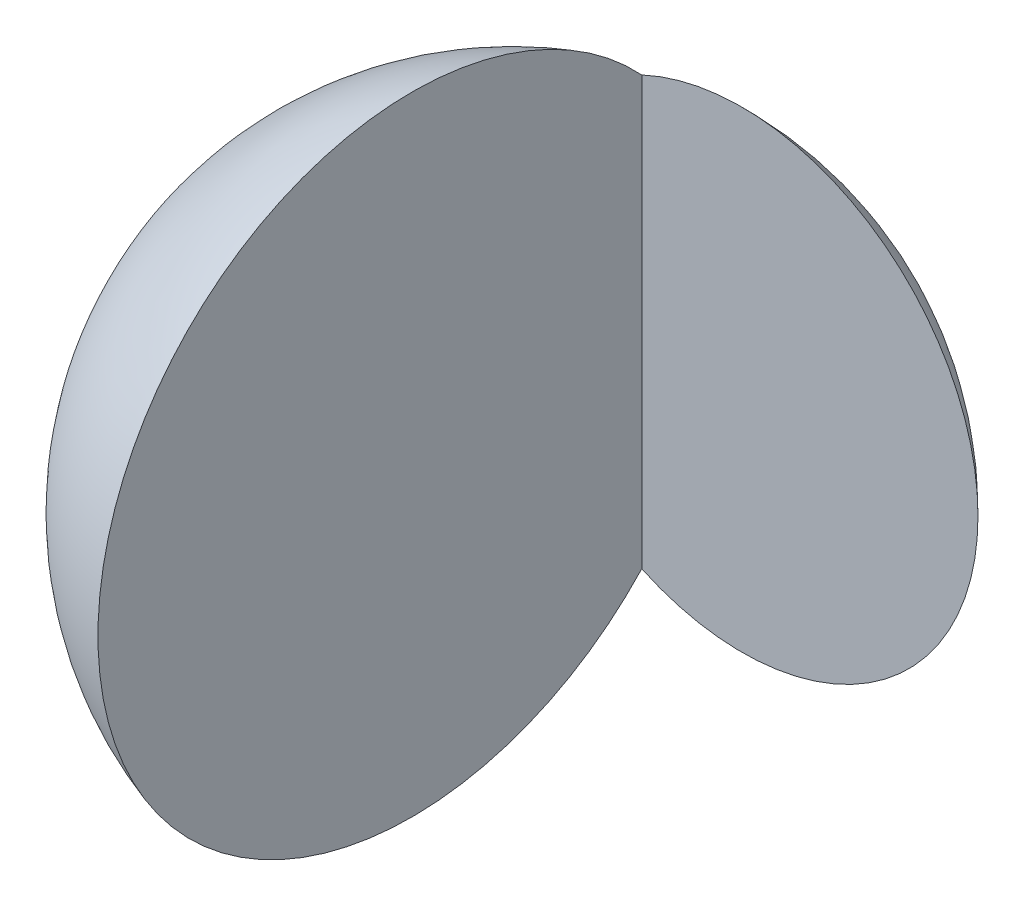
ISO-10303-21;
HEADER;
FILE_DESCRIPTION(('STEP AP214'),'2;1');
FILE_NAME('part.step','',(''),(''),'','','');
FILE_SCHEMA(('AUTOMOTIVE_DESIGN { 1 0 10303 214 1 1 1 1 }'));
ENDSEC;
DATA;
#1=APPLICATION_CONTEXT('core data for automotive mechanical design processes');
#2=APPLICATION_PROTOCOL_DEFINITION('international standard','automotive_design',2000,#1);
#3=PRODUCT_CONTEXT('',#1,'mechanical');
#4=PRODUCT('Part','Part','',(#3));
#5=PRODUCT_RELATED_PRODUCT_CATEGORY('part','',(#4));
#6=PRODUCT_DEFINITION_FORMATION('','',#4);
#7=PRODUCT_DEFINITION_CONTEXT('part definition',#1,'design');
#8=PRODUCT_DEFINITION('design','',#6,#7);
#9=PRODUCT_DEFINITION_SHAPE('','',#8);
#10=(LENGTH_UNIT() NAMED_UNIT(*) SI_UNIT(.MILLI.,.METRE.));
#11=(NAMED_UNIT(*) PLANE_ANGLE_UNIT() SI_UNIT($,.RADIAN.));
#12=(NAMED_UNIT(*) SI_UNIT($,.STERADIAN.) SOLID_ANGLE_UNIT());
#13=UNCERTAINTY_MEASURE_WITH_UNIT(LENGTH_MEASURE(1.E-05),#10,'distance_accuracy_value','');
#14=(GEOMETRIC_REPRESENTATION_CONTEXT(3) GLOBAL_UNCERTAINTY_ASSIGNED_CONTEXT((#13)) GLOBAL_UNIT_ASSIGNED_CONTEXT((#10,
#11,#12)) REPRESENTATION_CONTEXT('',''));
#15=CARTESIAN_POINT('',(0.,0.,0.));
#16=DIRECTION('',(0.,0.,1.));
#17=DIRECTION('',(1.,0.,0.));
#18=AXIS2_PLACEMENT_3D('',#15,#16,#17);
#19=CARTESIAN_POINT('',(0.,0.,0.));
#20=DIRECTION('',(-1.,0.,0.));
#21=DIRECTION('',(0.,0.,-1.));
#22=AXIS2_PLACEMENT_3D('',#19,#20,#21);
#23=SPHERICAL_SURFACE('',#22,27.6246746870325);
#24=CARTESIAN_POINT('',(0.,0.,-19.2696181881615));
#25=DIRECTION('',(0.,0.,-1.));
#26=DIRECTION('',(-1.,0.,0.));
#27=AXIS2_PLACEMENT_3D('',#24,#25,#26);
#28=CIRCLE('',#27,19.7940512893861);
#29=CARTESIAN_POINT('',(-8.39351755871575,17.9263306183496,-19.2696181881615));
#30=VERTEX_POINT('',#29);
#31=CARTESIAN_POINT('',(-8.39351755871575,-17.9263306183496,-19.2696181881615));
#32=VERTEX_POINT('',#31);
#33=EDGE_CURVE('E40',#30,#32,#28,.T.);
#34=ORIENTED_EDGE('',*,*,#33,.T.);
#35=CARTESIAN_POINT('',(-8.39351755871575,0.,0.));
#36=DIRECTION('',(-1.,0.,0.));
#37=DIRECTION('',(0.,0.,1.));
#38=AXIS2_PLACEMENT_3D('',#35,#36,#37);
#39=CIRCLE('',#38,26.3186533575695);
#40=EDGE_CURVE('E11',#32,#30,#39,.T.);
#41=ORIENTED_EDGE('',*,*,#40,.T.);
#42=EDGE_LOOP('',(#34,#41));
#43=FACE_BOUND('',#42,.T.);
#44=ADVANCED_FACE('F33',(#43),#23,.T.);
#45=CARTESIAN_POINT('',(-8.39351755871576,-27.6246746870325,-19.2696181881615));
#46=DIRECTION('',(-1.,0.,0.));
#47=DIRECTION('',(0.,0.,1.));
#48=AXIS2_PLACEMENT_3D('',#45,#46,#47);
#49=PLANE('',#48);
#50=DIRECTION('',(0.,1.,0.));
#51=VECTOR('',#50,1.);
#52=CARTESIAN_POINT('',(-8.39351755871576,-27.6246746870325,-19.2696181881615));
#53=LINE('',#52,#51);
#54=EDGE_CURVE('E46',#32,#30,#53,.T.);
#55=ORIENTED_EDGE('',*,*,#54,.T.);
#56=ORIENTED_EDGE('',*,*,#40,.F.);
#57=EDGE_LOOP('',(#55,#56));
#58=FACE_BOUND('',#57,.T.);
#59=ADVANCED_FACE('F52',(#58),#49,.F.);
#60=CARTESIAN_POINT('',(-8.39351755871576,-27.6246746870325,-19.2696181881615));
#61=DIRECTION('',(0.,0.,-1.));
#62=DIRECTION('',(-1.,0.,0.));
#63=AXIS2_PLACEMENT_3D('',#60,#61,#62);
#64=PLANE('',#63);
#65=ORIENTED_EDGE('',*,*,#54,.F.);
#66=ORIENTED_EDGE('',*,*,#33,.F.);
#67=EDGE_LOOP('',(#65,#66));
#68=FACE_BOUND('',#67,.T.);
#69=ADVANCED_FACE('F49',(#68),#64,.F.);
#70=CLOSED_SHELL('',(#44,#59,#69));
#71=MANIFOLD_SOLID_BREP('B2',#70);
#72=ADVANCED_BREP_SHAPE_REPRESENTATION('',(#18,#71),#14);
#73=SHAPE_DEFINITION_REPRESENTATION(#9,#72);
ENDSEC;
END-ISO-10303-21;
